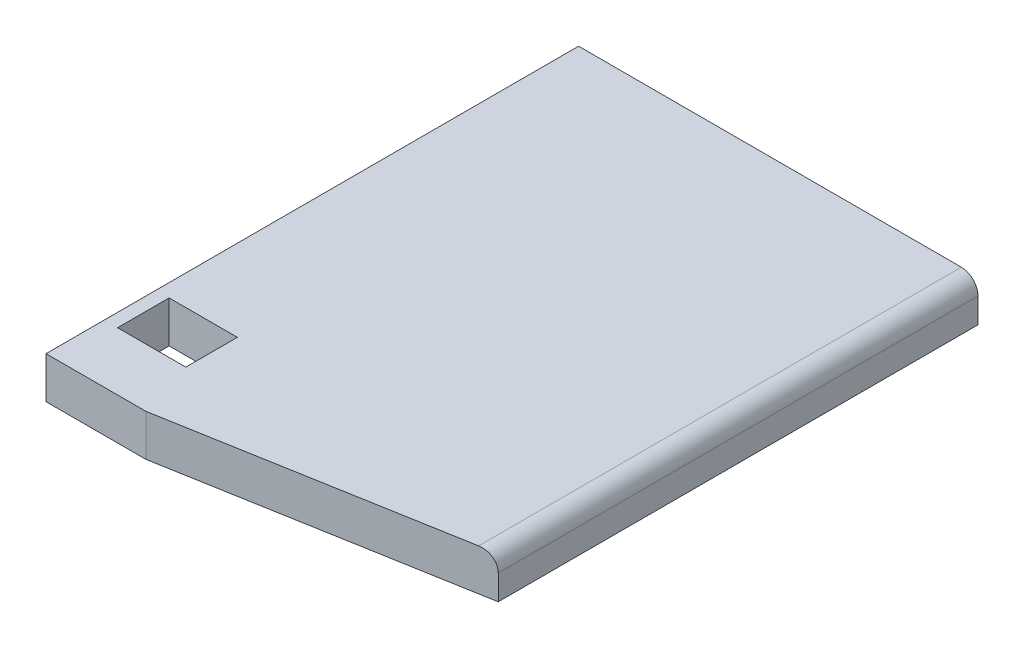
ISO-10303-21;
HEADER;
FILE_DESCRIPTION(('STEP AP214'),'2;1');
FILE_NAME('part.step','',(''),(''),'','','');
FILE_SCHEMA(('AUTOMOTIVE_DESIGN { 1 0 10303 214 1 1 1 1 }'));
ENDSEC;
DATA;
#1=APPLICATION_CONTEXT('core data for automotive mechanical design processes');
#2=APPLICATION_PROTOCOL_DEFINITION('international standard','automotive_design',2000,#1);
#3=PRODUCT_CONTEXT('',#1,'mechanical');
#4=PRODUCT('Part','Part','',(#3));
#5=PRODUCT_RELATED_PRODUCT_CATEGORY('part','',(#4));
#6=PRODUCT_DEFINITION_FORMATION('','',#4);
#7=PRODUCT_DEFINITION_CONTEXT('part definition',#1,'design');
#8=PRODUCT_DEFINITION('design','',#6,#7);
#9=PRODUCT_DEFINITION_SHAPE('','',#8);
#10=(LENGTH_UNIT() NAMED_UNIT(*) SI_UNIT(.MILLI.,.METRE.));
#11=(NAMED_UNIT(*) PLANE_ANGLE_UNIT() SI_UNIT($,.RADIAN.));
#12=(NAMED_UNIT(*) SI_UNIT($,.STERADIAN.) SOLID_ANGLE_UNIT());
#13=UNCERTAINTY_MEASURE_WITH_UNIT(LENGTH_MEASURE(1.E-05),#10,'distance_accuracy_value','');
#14=(GEOMETRIC_REPRESENTATION_CONTEXT(3) GLOBAL_UNCERTAINTY_ASSIGNED_CONTEXT((#13)) GLOBAL_UNIT_ASSIGNED_CONTEXT((#10,
#11,#12)) REPRESENTATION_CONTEXT('',''));
#15=CARTESIAN_POINT('',(0.,0.,0.));
#16=DIRECTION('',(0.,0.,1.));
#17=DIRECTION('',(1.,0.,0.));
#18=AXIS2_PLACEMENT_3D('',#15,#16,#17);
#19=CARTESIAN_POINT('',(0.,0.,33.));
#20=DIRECTION('',(0.,1.,0.));
#21=DIRECTION('',(-1.,0.,0.));
#22=AXIS2_PLACEMENT_3D('',#19,#20,#21);
#23=PLANE('',#22);
#24=DIRECTION('',(1.,0.,0.));
#25=VECTOR('',#24,1.);
#26=CARTESIAN_POINT('',(24.,0.,32.));
#27=LINE('',#26,#25);
#28=CARTESIAN_POINT('',(0.,0.,32.));
#29=VERTEX_POINT('',#28);
#30=CARTESIAN_POINT('',(6.,0.,32.));
#31=VERTEX_POINT('',#30);
#32=EDGE_CURVE('E193',#29,#31,#27,.T.);
#33=ORIENTED_EDGE('',*,*,#32,.F.);
#34=DIRECTION('',(0.,0.,-1.));
#35=VECTOR('',#34,1.);
#36=CARTESIAN_POINT('',(0.,0.,33.));
#37=LINE('',#36,#35);
#38=CARTESIAN_POINT('',(0.,0.,0.));
#39=VERTEX_POINT('',#38);
#40=EDGE_CURVE('E159',#29,#39,#37,.T.);
#41=ORIENTED_EDGE('',*,*,#40,.T.);
#42=DIRECTION('',(1.,0.,0.));
#43=VECTOR('',#42,1.);
#44=CARTESIAN_POINT('',(0.,0.,0.));
#45=LINE('',#44,#43);
#46=CARTESIAN_POINT('',(24.,0.,0.));
#47=VERTEX_POINT('',#46);
#48=EDGE_CURVE('E147',#39,#47,#45,.T.);
#49=ORIENTED_EDGE('',*,*,#48,.T.);
#50=DIRECTION('',(0.,0.,-1.));
#51=VECTOR('',#50,1.);
#52=CARTESIAN_POINT('',(24.,0.,33.));
#53=LINE('',#52,#51);
#54=CARTESIAN_POINT('',(24.,0.,28.8261143472476));
#55=VERTEX_POINT('',#54);
#56=EDGE_CURVE('E163',#55,#47,#53,.T.);
#57=ORIENTED_EDGE('',*,*,#56,.F.);
#58=DIRECTION('',(0.984807753012208,0.,-0.173648177666931));
#59=VECTOR('',#58,1.);
#60=CARTESIAN_POINT('',(6.,0.,32.));
#61=LINE('',#60,#59);
#62=EDGE_CURVE('E205',#31,#55,#61,.T.);
#63=ORIENTED_EDGE('',*,*,#62,.F.);
#64=EDGE_LOOP('',(#33,#41,#49,#57,#63));
#65=FACE_BOUND('',#64,.T.);
#66=DIRECTION('',(0.,0.,1.));
#67=VECTOR('',#66,1.);
#68=CARTESIAN_POINT('',(0.800000000000001,0.,28.5));
#69=LINE('',#68,#67);
#70=CARTESIAN_POINT('',(0.800000000000001,0.,25.4));
#71=VERTEX_POINT('',#70);
#72=CARTESIAN_POINT('',(0.800000000000002,0.,28.5));
#73=VERTEX_POINT('',#72);
#74=EDGE_CURVE('E121',#71,#73,#69,.T.);
#75=ORIENTED_EDGE('',*,*,#74,.T.);
#76=DIRECTION('',(-1.,0.,0.));
#77=VECTOR('',#76,1.);
#78=CARTESIAN_POINT('',(4.9,0.,28.5));
#79=LINE('',#78,#77);
#80=CARTESIAN_POINT('',(4.9,0.,28.5));
#81=VERTEX_POINT('',#80);
#82=EDGE_CURVE('E56',#81,#73,#79,.T.);
#83=ORIENTED_EDGE('',*,*,#82,.F.);
#84=DIRECTION('',(0.,0.,1.));
#85=VECTOR('',#84,1.);
#86=CARTESIAN_POINT('',(4.9,0.,28.5));
#87=LINE('',#86,#85);
#88=CARTESIAN_POINT('',(4.9,0.,25.4));
#89=VERTEX_POINT('',#88);
#90=EDGE_CURVE('E143',#89,#81,#87,.T.);
#91=ORIENTED_EDGE('',*,*,#90,.F.);
#92=DIRECTION('',(-1.,0.,0.));
#93=VECTOR('',#92,1.);
#94=CARTESIAN_POINT('',(4.9,0.,25.4));
#95=LINE('',#94,#93);
#96=EDGE_CURVE('E138',#89,#71,#95,.T.);
#97=ORIENTED_EDGE('',*,*,#96,.T.);
#98=EDGE_LOOP('',(#75,#83,#91,#97));
#99=FACE_BOUND('',#98,.T.);
#100=ADVANCED_FACE('F41',(#65,#99),#23,.F.);
#101=CARTESIAN_POINT('',(0.,2.5,33.));
#102=DIRECTION('',(0.,-1.,0.));
#103=DIRECTION('',(1.,0.,0.));
#104=AXIS2_PLACEMENT_3D('',#101,#102,#103);
#105=PLANE('',#104);
#106=DIRECTION('',(-1.,0.,0.));
#107=VECTOR('',#106,1.);
#108=CARTESIAN_POINT('',(4.9,2.5,28.5));
#109=LINE('',#108,#107);
#110=CARTESIAN_POINT('',(4.9,2.5,28.5));
#111=VERTEX_POINT('',#110);
#112=CARTESIAN_POINT('',(0.800000000000001,2.5,28.5));
#113=VERTEX_POINT('',#112);
#114=EDGE_CURVE('E132',#111,#113,#109,.T.);
#115=ORIENTED_EDGE('',*,*,#114,.T.);
#116=DIRECTION('',(0.,0.,-1.));
#117=VECTOR('',#116,1.);
#118=CARTESIAN_POINT('',(0.800000000000001,2.5,28.5));
#119=LINE('',#118,#117);
#120=CARTESIAN_POINT('',(0.800000000000001,2.5,25.4));
#121=VERTEX_POINT('',#120);
#122=EDGE_CURVE('E120',#113,#121,#119,.T.);
#123=ORIENTED_EDGE('',*,*,#122,.T.);
#124=DIRECTION('',(-1.,0.,0.));
#125=VECTOR('',#124,1.);
#126=CARTESIAN_POINT('',(4.9,2.5,25.4));
#127=LINE('',#126,#125);
#128=CARTESIAN_POINT('',(4.9,2.5,25.4));
#129=VERTEX_POINT('',#128);
#130=EDGE_CURVE('E131',#129,#121,#127,.T.);
#131=ORIENTED_EDGE('',*,*,#130,.F.);
#132=DIRECTION('',(0.,0.,-1.));
#133=VECTOR('',#132,1.);
#134=CARTESIAN_POINT('',(4.9,2.5,28.5));
#135=LINE('',#134,#133);
#136=EDGE_CURVE('E196',#111,#129,#135,.T.);
#137=ORIENTED_EDGE('',*,*,#136,.F.);
#138=EDGE_LOOP('',(#115,#123,#131,#137));
#139=FACE_BOUND('',#138,.T.);
#140=DIRECTION('',(-1.,0.,0.));
#141=VECTOR('',#140,1.);
#142=CARTESIAN_POINT('',(24.,2.5,32.));
#143=LINE('',#142,#141);
#144=CARTESIAN_POINT('',(6.,2.5,32.));
#145=VERTEX_POINT('',#144);
#146=CARTESIAN_POINT('',(0.,2.5,32.));
#147=VERTEX_POINT('',#146);
#148=EDGE_CURVE('E182',#145,#147,#143,.T.);
#149=ORIENTED_EDGE('',*,*,#148,.F.);
#150=DIRECTION('',(0.984807753012208,0.,-0.173648177666931));
#151=VECTOR('',#150,1.);
#152=CARTESIAN_POINT('',(6.,2.50000000000001,32.));
#153=LINE('',#152,#151);
#154=CARTESIAN_POINT('',(23.,2.50000000000001,29.0024413279561));
#155=VERTEX_POINT('',#154);
#156=EDGE_CURVE('E209',#145,#155,#153,.T.);
#157=ORIENTED_EDGE('',*,*,#156,.T.);
#158=DIRECTION('',(0.,0.,-1.));
#159=VECTOR('',#158,1.);
#160=CARTESIAN_POINT('',(23.,2.5,33.));
#161=LINE('',#160,#159);
#162=CARTESIAN_POINT('',(23.,2.5,0.));
#163=VERTEX_POINT('',#162);
#164=EDGE_CURVE('E165',#155,#163,#161,.T.);
#165=ORIENTED_EDGE('',*,*,#164,.T.);
#166=DIRECTION('',(-1.,0.,0.));
#167=VECTOR('',#166,1.);
#168=CARTESIAN_POINT('',(0.,2.5,0.));
#169=LINE('',#168,#167);
#170=CARTESIAN_POINT('',(0.,2.5,0.));
#171=VERTEX_POINT('',#170);
#172=EDGE_CURVE('E153',#163,#171,#169,.T.);
#173=ORIENTED_EDGE('',*,*,#172,.T.);
#174=DIRECTION('',(0.,0.,-1.));
#175=VECTOR('',#174,1.);
#176=CARTESIAN_POINT('',(0.,2.5,33.));
#177=LINE('',#176,#175);
#178=EDGE_CURVE('E161',#147,#171,#177,.T.);
#179=ORIENTED_EDGE('',*,*,#178,.F.);
#180=EDGE_LOOP('',(#149,#157,#165,#173,#179));
#181=FACE_BOUND('',#180,.T.);
#182=ADVANCED_FACE('F128',(#139,#181),#105,.F.);
#183=CARTESIAN_POINT('',(23.,1.5,33.));
#184=DIRECTION('',(0.,0.,-1.));
#185=DIRECTION('',(-1.,0.,0.));
#186=AXIS2_PLACEMENT_3D('',#183,#184,#185);
#187=CYLINDRICAL_SURFACE('',#186,1.);
#188=CARTESIAN_POINT('',(23.,1.5,29.0024413279561));
#189=DIRECTION('',(-0.173648177666931,0.,-0.984807753012208));
#190=DIRECTION('',(0.984807753012208,0.,-0.173648177666931));
#191=AXIS2_PLACEMENT_3D('',#188,#189,#190);
#192=ELLIPSE('',#191,1.01542661188575,1.);
#193=CARTESIAN_POINT('',(24.,1.5,28.8261143472476));
#194=VERTEX_POINT('',#193);
#195=EDGE_CURVE('E179',#194,#155,#192,.F.);
#196=ORIENTED_EDGE('',*,*,#195,.F.);
#197=DIRECTION('',(0.,0.,-1.));
#198=VECTOR('',#197,1.);
#199=CARTESIAN_POINT('',(24.,1.5,33.));
#200=LINE('',#199,#198);
#201=CARTESIAN_POINT('',(24.,1.5,0.));
#202=VERTEX_POINT('',#201);
#203=EDGE_CURVE('E49',#202,#194,#200,.F.);
#204=ORIENTED_EDGE('',*,*,#203,.F.);
#205=CARTESIAN_POINT('',(23.,1.5,0.));
#206=DIRECTION('',(0.,0.,1.));
#207=DIRECTION('',(1.,0.,0.));
#208=AXIS2_PLACEMENT_3D('',#205,#206,#207);
#209=CIRCLE('',#208,1.);
#210=EDGE_CURVE('E11',#163,#202,#209,.F.);
#211=ORIENTED_EDGE('',*,*,#210,.F.);
#212=ORIENTED_EDGE('',*,*,#164,.F.);
#213=EDGE_LOOP('',(#196,#204,#211,#212));
#214=FACE_BOUND('',#213,.T.);
#215=ADVANCED_FACE('F43',(#214),#187,.T.);
#216=CARTESIAN_POINT('',(24.,0.,33.));
#217=DIRECTION('',(-1.,0.,0.));
#218=DIRECTION('',(0.,0.,1.));
#219=AXIS2_PLACEMENT_3D('',#216,#217,#218);
#220=PLANE('',#219);
#221=ORIENTED_EDGE('',*,*,#203,.T.);
#222=DIRECTION('',(0.,-1.,0.));
#223=VECTOR('',#222,1.);
#224=CARTESIAN_POINT('',(24.,2.50000000000001,28.8261143472476));
#225=LINE('',#224,#223);
#226=EDGE_CURVE('E171',#194,#55,#225,.T.);
#227=ORIENTED_EDGE('',*,*,#226,.T.);
#228=ORIENTED_EDGE('',*,*,#56,.T.);
#229=DIRECTION('',(0.,1.,0.));
#230=VECTOR('',#229,1.);
#231=CARTESIAN_POINT('',(24.,0.,0.));
#232=LINE('',#231,#230);
#233=EDGE_CURVE('E150',#47,#202,#232,.T.);
#234=ORIENTED_EDGE('',*,*,#233,.T.);
#235=EDGE_LOOP('',(#221,#227,#228,#234));
#236=FACE_BOUND('',#235,.T.);
#237=ADVANCED_FACE('F170',(#236),#220,.F.);
#238=CARTESIAN_POINT('',(0.,0.,33.));
#239=DIRECTION('',(1.,0.,0.));
#240=DIRECTION('',(0.,0.,-1.));
#241=AXIS2_PLACEMENT_3D('',#238,#239,#240);
#242=PLANE('',#241);
#243=ORIENTED_EDGE('',*,*,#40,.F.);
#244=DIRECTION('',(0.,-1.,0.));
#245=VECTOR('',#244,1.);
#246=CARTESIAN_POINT('',(0.,0.,32.));
#247=LINE('',#246,#245);
#248=EDGE_CURVE('E185',#147,#29,#247,.T.);
#249=ORIENTED_EDGE('',*,*,#248,.F.);
#250=ORIENTED_EDGE('',*,*,#178,.T.);
#251=DIRECTION('',(0.,-1.,0.));
#252=VECTOR('',#251,1.);
#253=CARTESIAN_POINT('',(0.,0.,0.));
#254=LINE('',#253,#252);
#255=EDGE_CURVE('E156',#171,#39,#254,.T.);
#256=ORIENTED_EDGE('',*,*,#255,.T.);
#257=EDGE_LOOP('',(#243,#249,#250,#256));
#258=FACE_BOUND('',#257,.T.);
#259=ADVANCED_FACE('F221',(#258),#242,.F.);
#260=CARTESIAN_POINT('',(0.,0.,0.));
#261=DIRECTION('',(0.,0.,1.));
#262=DIRECTION('',(1.,0.,0.));
#263=AXIS2_PLACEMENT_3D('',#260,#261,#262);
#264=PLANE('',#263);
#265=ORIENTED_EDGE('',*,*,#172,.F.);
#266=ORIENTED_EDGE('',*,*,#210,.T.);
#267=ORIENTED_EDGE('',*,*,#233,.F.);
#268=ORIENTED_EDGE('',*,*,#48,.F.);
#269=ORIENTED_EDGE('',*,*,#255,.F.);
#270=EDGE_LOOP('',(#265,#266,#267,#268,#269));
#271=FACE_BOUND('',#270,.T.);
#272=ADVANCED_FACE('F225',(#271),#264,.F.);
#273=CARTESIAN_POINT('',(4.9,2.5,28.5));
#274=DIRECTION('',(0.,0.,1.));
#275=DIRECTION('',(1.,0.,0.));
#276=AXIS2_PLACEMENT_3D('',#273,#274,#275);
#277=PLANE('',#276);
#278=ORIENTED_EDGE('',*,*,#82,.T.);
#279=DIRECTION('',(0.,1.,0.));
#280=VECTOR('',#279,1.);
#281=CARTESIAN_POINT('',(0.800000000000002,-3.20156211871642,28.5));
#282=LINE('',#281,#280);
#283=EDGE_CURVE('E61',#73,#113,#282,.T.);
#284=ORIENTED_EDGE('',*,*,#283,.T.);
#285=ORIENTED_EDGE('',*,*,#114,.F.);
#286=DIRECTION('',(0.,1.,0.));
#287=VECTOR('',#286,1.);
#288=CARTESIAN_POINT('',(4.9,2.5,28.5));
#289=LINE('',#288,#287);
#290=EDGE_CURVE('E139',#81,#111,#289,.T.);
#291=ORIENTED_EDGE('',*,*,#290,.F.);
#292=EDGE_LOOP('',(#278,#284,#285,#291));
#293=FACE_BOUND('',#292,.T.);
#294=ADVANCED_FACE('F204',(#293),#277,.F.);
#295=CARTESIAN_POINT('',(4.9,2.5,25.4));
#296=DIRECTION('',(0.,0.,-1.));
#297=DIRECTION('',(-1.,0.,0.));
#298=AXIS2_PLACEMENT_3D('',#295,#296,#297);
#299=PLANE('',#298);
#300=ORIENTED_EDGE('',*,*,#130,.T.);
#301=DIRECTION('',(0.,1.,0.));
#302=VECTOR('',#301,1.);
#303=CARTESIAN_POINT('',(0.800000000000002,-3.20156211871642,25.4));
#304=LINE('',#303,#302);
#305=EDGE_CURVE('E117',#71,#121,#304,.T.);
#306=ORIENTED_EDGE('',*,*,#305,.F.);
#307=ORIENTED_EDGE('',*,*,#96,.F.);
#308=DIRECTION('',(0.,-1.,0.));
#309=VECTOR('',#308,1.);
#310=CARTESIAN_POINT('',(4.9,2.5,25.4));
#311=LINE('',#310,#309);
#312=EDGE_CURVE('E136',#129,#89,#311,.T.);
#313=ORIENTED_EDGE('',*,*,#312,.F.);
#314=EDGE_LOOP('',(#300,#306,#307,#313));
#315=FACE_BOUND('',#314,.T.);
#316=ADVANCED_FACE('F134',(#315),#299,.F.);
#317=CARTESIAN_POINT('',(4.9,0.,0.));
#318=DIRECTION('',(-1.,0.,0.));
#319=DIRECTION('',(0.,0.,1.));
#320=AXIS2_PLACEMENT_3D('',#317,#318,#319);
#321=PLANE('',#320);
#322=ORIENTED_EDGE('',*,*,#136,.T.);
#323=ORIENTED_EDGE('',*,*,#312,.T.);
#324=ORIENTED_EDGE('',*,*,#90,.T.);
#325=ORIENTED_EDGE('',*,*,#290,.T.);
#326=EDGE_LOOP('',(#322,#323,#324,#325));
#327=FACE_BOUND('',#326,.T.);
#328=ADVANCED_FACE('F202',(#327),#321,.T.);
#329=CARTESIAN_POINT('',(0.,0.,32.));
#330=DIRECTION('',(0.,0.,1.));
#331=DIRECTION('',(1.,0.,0.));
#332=AXIS2_PLACEMENT_3D('',#329,#330,#331);
#333=PLANE('',#332);
#334=DIRECTION('',(0.,-1.,0.));
#335=VECTOR('',#334,1.);
#336=CARTESIAN_POINT('',(6.,2.50000000000001,32.));
#337=LINE('',#336,#335);
#338=EDGE_CURVE('E187',#145,#31,#337,.T.);
#339=ORIENTED_EDGE('',*,*,#338,.F.);
#340=ORIENTED_EDGE('',*,*,#148,.T.);
#341=ORIENTED_EDGE('',*,*,#248,.T.);
#342=ORIENTED_EDGE('',*,*,#32,.T.);
#343=EDGE_LOOP('',(#339,#340,#341,#342));
#344=FACE_BOUND('',#343,.T.);
#345=ADVANCED_FACE('F217',(#344),#333,.T.);
#346=CARTESIAN_POINT('',(6.,2.50000000000001,32.));
#347=DIRECTION('',(-0.173648177666931,0.,-0.984807753012208));
#348=DIRECTION('',(-0.984807753012208,0.,0.173648177666931));
#349=AXIS2_PLACEMENT_3D('',#346,#347,#348);
#350=PLANE('',#349);
#351=ORIENTED_EDGE('',*,*,#195,.T.);
#352=ORIENTED_EDGE('',*,*,#156,.F.);
#353=ORIENTED_EDGE('',*,*,#338,.T.);
#354=ORIENTED_EDGE('',*,*,#62,.T.);
#355=ORIENTED_EDGE('',*,*,#226,.F.);
#356=EDGE_LOOP('',(#351,#352,#353,#354,#355));
#357=FACE_BOUND('',#356,.T.);
#358=ADVANCED_FACE('F212',(#357),#350,.F.);
#359=CARTESIAN_POINT('',(0.800000000000002,-3.20156211871642,28.5));
#360=DIRECTION('',(1.,0.,0.));
#361=DIRECTION('',(0.,1.,0.));
#362=AXIS2_PLACEMENT_3D('',#359,#360,#361);
#363=PLANE('',#362);
#364=ORIENTED_EDGE('',*,*,#74,.F.);
#365=ORIENTED_EDGE('',*,*,#305,.T.);
#366=ORIENTED_EDGE('',*,*,#122,.F.);
#367=ORIENTED_EDGE('',*,*,#283,.F.);
#368=EDGE_LOOP('',(#364,#365,#366,#367));
#369=FACE_BOUND('',#368,.T.);
#370=ADVANCED_FACE('F119',(#369),#363,.T.);
#371=CLOSED_SHELL('',(#100,#182,#215,#237,#259,#272,#294,#316,#328,#345,#358,#370));
#372=MANIFOLD_SOLID_BREP('B2',#371);
#373=ADVANCED_BREP_SHAPE_REPRESENTATION('',(#18,#372),#14);
#374=SHAPE_DEFINITION_REPRESENTATION(#9,#373);
ENDSEC;
END-ISO-10303-21;
